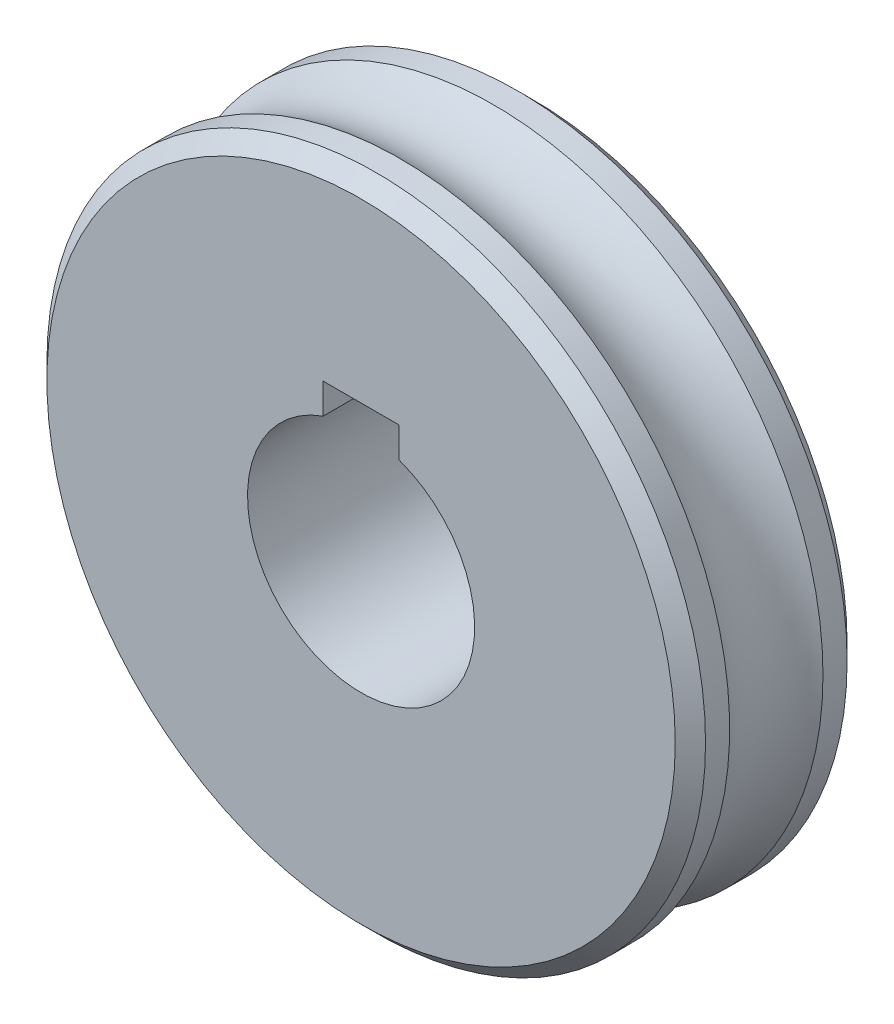
ISO-10303-21;
HEADER;
FILE_DESCRIPTION(('STEP AP214'),'2;1');
FILE_NAME('part.step','',(''),(''),'','','');
FILE_SCHEMA(('AUTOMOTIVE_DESIGN { 1 0 10303 214 1 1 1 1 }'));
ENDSEC;
DATA;
#1=APPLICATION_CONTEXT('core data for automotive mechanical design processes');
#2=APPLICATION_PROTOCOL_DEFINITION('international standard','automotive_design',2000,#1);
#3=PRODUCT_CONTEXT('',#1,'mechanical');
#4=PRODUCT('Part','Part','',(#3));
#5=PRODUCT_RELATED_PRODUCT_CATEGORY('part','',(#4));
#6=PRODUCT_DEFINITION_FORMATION('','',#4);
#7=PRODUCT_DEFINITION_CONTEXT('part definition',#1,'design');
#8=PRODUCT_DEFINITION('design','',#6,#7);
#9=PRODUCT_DEFINITION_SHAPE('','',#8);
#10=(LENGTH_UNIT() NAMED_UNIT(*) SI_UNIT(.MILLI.,.METRE.));
#11=(NAMED_UNIT(*) PLANE_ANGLE_UNIT() SI_UNIT($,.RADIAN.));
#12=(NAMED_UNIT(*) SI_UNIT($,.STERADIAN.) SOLID_ANGLE_UNIT());
#13=UNCERTAINTY_MEASURE_WITH_UNIT(LENGTH_MEASURE(1.E-05),#10,'distance_accuracy_value','');
#14=(GEOMETRIC_REPRESENTATION_CONTEXT(3) GLOBAL_UNCERTAINTY_ASSIGNED_CONTEXT((#13)) GLOBAL_UNIT_ASSIGNED_CONTEXT((#10,
#11,#12)) REPRESENTATION_CONTEXT('',''));
#15=CARTESIAN_POINT('',(0.,0.,0.));
#16=DIRECTION('',(0.,0.,1.));
#17=DIRECTION('',(1.,0.,0.));
#18=AXIS2_PLACEMENT_3D('',#15,#16,#17);
#19=CARTESIAN_POINT('',(0.,0.,11.35));
#20=DIRECTION('',(0.,0.,-1.));
#21=DIRECTION('',(-1.,0.,0.));
#22=AXIS2_PLACEMENT_3D('',#19,#20,#21);
#23=CYLINDRICAL_SURFACE('',#22,43.5);
#24=CARTESIAN_POINT('',(0.,0.,-9.35000000000001));
#25=DIRECTION('',(0.,0.,1.));
#26=DIRECTION('',(1.,0.,0.));
#27=AXIS2_PLACEMENT_3D('',#24,#25,#26);
#28=CIRCLE('',#27,43.5);
#29=CARTESIAN_POINT('',(43.5,0.,-9.35000000000001));
#30=VERTEX_POINT('',#29);
#31=EDGE_CURVE('E122',#30,#30,#28,.T.);
#32=ORIENTED_EDGE('',*,*,#31,.T.);
#33=EDGE_LOOP('',(#32));
#34=FACE_BOUND('',#33,.T.);
#35=CARTESIAN_POINT('',(0.,0.,-6.16441400296897));
#36=DIRECTION('',(0.,0.,1.));
#37=DIRECTION('',(1.,0.,0.));
#38=AXIS2_PLACEMENT_3D('',#35,#36,#37);
#39=CIRCLE('',#38,43.5);
#40=CARTESIAN_POINT('',(43.5,0.,-6.16441400296897));
#41=VERTEX_POINT('',#40);
#42=EDGE_CURVE('E44',#41,#41,#39,.T.);
#43=ORIENTED_EDGE('',*,*,#42,.F.);
#44=EDGE_LOOP('',(#43));
#45=FACE_BOUND('',#44,.T.);
#46=ADVANCED_FACE('F39',(#34,#45),#23,.T.);
#47=CARTESIAN_POINT('',(0.,0.,9.34999999999998));
#48=DIRECTION('',(0.,0.,1.));
#49=DIRECTION('',(1.,0.,0.));
#50=AXIS2_PLACEMENT_3D('',#47,#48,#49);
#51=CIRCLE('',#50,43.5);
#52=CARTESIAN_POINT('',(43.5,0.,9.34999999999998));
#53=VERTEX_POINT('',#52);
#54=EDGE_CURVE('E99',#53,#53,#51,.F.);
#55=ORIENTED_EDGE('',*,*,#54,.T.);
#56=EDGE_LOOP('',(#55));
#57=FACE_BOUND('',#56,.T.);
#58=CARTESIAN_POINT('',(0.,0.,6.16441400296897));
#59=DIRECTION('',(0.,0.,-1.));
#60=DIRECTION('',(-1.,0.,0.));
#61=AXIS2_PLACEMENT_3D('',#58,#59,#60);
#62=CIRCLE('',#61,43.5);
#63=CARTESIAN_POINT('',(-43.5,0.,6.16441400296897));
#64=VERTEX_POINT('',#63);
#65=EDGE_CURVE('E126',#64,#64,#62,.T.);
#66=ORIENTED_EDGE('',*,*,#65,.F.);
#67=EDGE_LOOP('',(#66));
#68=FACE_BOUND('',#67,.T.);
#69=ADVANCED_FACE('F136',(#57,#68),#23,.T.);
#70=CARTESIAN_POINT('',(0.,0.,11.35));
#71=DIRECTION('',(0.,0.,1.));
#72=DIRECTION('',(1.,0.,0.));
#73=AXIS2_PLACEMENT_3D('',#70,#71,#72);
#74=PLANE('',#73);
#75=CARTESIAN_POINT('',(0.,0.,11.35));
#76=DIRECTION('',(0.,0.,1.));
#77=DIRECTION('',(1.,0.,0.));
#78=AXIS2_PLACEMENT_3D('',#75,#76,#77);
#79=CIRCLE('',#78,41.5);
#80=CARTESIAN_POINT('',(41.5,0.,11.35));
#81=VERTEX_POINT('',#80);
#82=EDGE_CURVE('E11',#81,#81,#79,.T.);
#83=ORIENTED_EDGE('',*,*,#82,.T.);
#84=EDGE_LOOP('',(#83));
#85=FACE_BOUND('',#84,.T.);
#86=CARTESIAN_POINT('',(0.,0.,11.35));
#87=DIRECTION('',(0.,0.,1.));
#88=DIRECTION('',(1.,0.,0.));
#89=AXIS2_PLACEMENT_3D('',#86,#87,#88);
#90=CIRCLE('',#89,15.);
#91=CARTESIAN_POINT('',(-5.,14.142135623731,11.35));
#92=VERTEX_POINT('',#91);
#93=CARTESIAN_POINT('',(5.,14.142135623731,11.35));
#94=VERTEX_POINT('',#93);
#95=EDGE_CURVE('E91',#92,#94,#90,.T.);
#96=ORIENTED_EDGE('',*,*,#95,.F.);
#97=DIRECTION('',(0.,-1.,0.));
#98=VECTOR('',#97,1.);
#99=CARTESIAN_POINT('',(-5.,18.142135623731,11.35));
#100=LINE('',#99,#98);
#101=CARTESIAN_POINT('',(-5.,18.142135623731,11.35));
#102=VERTEX_POINT('',#101);
#103=EDGE_CURVE('E83',#102,#92,#100,.T.);
#104=ORIENTED_EDGE('',*,*,#103,.F.);
#105=DIRECTION('',(-1.,0.,0.));
#106=VECTOR('',#105,1.);
#107=CARTESIAN_POINT('',(-5.,18.142135623731,11.35));
#108=LINE('',#107,#106);
#109=CARTESIAN_POINT('',(5.,18.142135623731,11.35));
#110=VERTEX_POINT('',#109);
#111=EDGE_CURVE('E106',#110,#102,#108,.T.);
#112=ORIENTED_EDGE('',*,*,#111,.F.);
#113=DIRECTION('',(0.,1.,0.));
#114=VECTOR('',#113,1.);
#115=CARTESIAN_POINT('',(5.,18.142135623731,11.35));
#116=LINE('',#115,#114);
#117=EDGE_CURVE('E104',#94,#110,#116,.T.);
#118=ORIENTED_EDGE('',*,*,#117,.F.);
#119=EDGE_LOOP('',(#96,#104,#112,#118));
#120=FACE_BOUND('',#119,.T.);
#121=ADVANCED_FACE('F103',(#85,#120),#74,.T.);
#122=CARTESIAN_POINT('',(0.,0.,-11.35));
#123=DIRECTION('',(0.,0.,1.));
#124=DIRECTION('',(1.,0.,0.));
#125=AXIS2_PLACEMENT_3D('',#122,#123,#124);
#126=PLANE('',#125);
#127=CARTESIAN_POINT('',(0.,0.,-11.35));
#128=DIRECTION('',(0.,0.,1.));
#129=DIRECTION('',(1.,0.,0.));
#130=AXIS2_PLACEMENT_3D('',#127,#128,#129);
#131=CIRCLE('',#130,41.5);
#132=CARTESIAN_POINT('',(41.5,0.,-11.35));
#133=VERTEX_POINT('',#132);
#134=EDGE_CURVE('E49',#133,#133,#131,.F.);
#135=ORIENTED_EDGE('',*,*,#134,.T.);
#136=EDGE_LOOP('',(#135));
#137=FACE_BOUND('',#136,.T.);
#138=DIRECTION('',(0.,-1.,0.));
#139=VECTOR('',#138,1.);
#140=CARTESIAN_POINT('',(-5.,18.142135623731,-11.35));
#141=LINE('',#140,#139);
#142=CARTESIAN_POINT('',(-5.,18.142135623731,-11.35));
#143=VERTEX_POINT('',#142);
#144=CARTESIAN_POINT('',(-5.,14.142135623731,-11.35));
#145=VERTEX_POINT('',#144);
#146=EDGE_CURVE('E65',#143,#145,#141,.T.);
#147=ORIENTED_EDGE('',*,*,#146,.T.);
#148=CARTESIAN_POINT('',(0.,0.,-11.35));
#149=DIRECTION('',(0.,0.,1.));
#150=DIRECTION('',(1.,0.,0.));
#151=AXIS2_PLACEMENT_3D('',#148,#149,#150);
#152=CIRCLE('',#151,15.);
#153=CARTESIAN_POINT('',(5.,14.142135623731,-11.35));
#154=VERTEX_POINT('',#153);
#155=EDGE_CURVE('E98',#145,#154,#152,.T.);
#156=ORIENTED_EDGE('',*,*,#155,.T.);
#157=DIRECTION('',(0.,1.,0.));
#158=VECTOR('',#157,1.);
#159=CARTESIAN_POINT('',(5.,18.142135623731,-11.35));
#160=LINE('',#159,#158);
#161=CARTESIAN_POINT('',(5.,18.142135623731,-11.35));
#162=VERTEX_POINT('',#161);
#163=EDGE_CURVE('E112',#154,#162,#160,.T.);
#164=ORIENTED_EDGE('',*,*,#163,.T.);
#165=DIRECTION('',(-1.,0.,0.));
#166=VECTOR('',#165,1.);
#167=CARTESIAN_POINT('',(-5.,18.142135623731,-11.35));
#168=LINE('',#167,#166);
#169=EDGE_CURVE('E92',#162,#143,#168,.T.);
#170=ORIENTED_EDGE('',*,*,#169,.T.);
#171=EDGE_LOOP('',(#147,#156,#164,#170));
#172=FACE_BOUND('',#171,.T.);
#173=ADVANCED_FACE('F144',(#137,#172),#126,.F.);
#174=CARTESIAN_POINT('',(-5.,18.142135623731,11.35));
#175=DIRECTION('',(1.,0.,0.));
#176=DIRECTION('',(0.,1.,0.));
#177=AXIS2_PLACEMENT_3D('',#174,#175,#176);
#178=PLANE('',#177);
#179=ORIENTED_EDGE('',*,*,#146,.F.);
#180=DIRECTION('',(0.,0.,-1.));
#181=VECTOR('',#180,1.);
#182=CARTESIAN_POINT('',(-5.,18.142135623731,11.35));
#183=LINE('',#182,#181);
#184=EDGE_CURVE('E87',#102,#143,#183,.T.);
#185=ORIENTED_EDGE('',*,*,#184,.F.);
#186=ORIENTED_EDGE('',*,*,#103,.T.);
#187=DIRECTION('',(0.,0.,-1.));
#188=VECTOR('',#187,1.);
#189=CARTESIAN_POINT('',(-5.,14.142135623731,11.35));
#190=LINE('',#189,#188);
#191=EDGE_CURVE('E86',#92,#145,#190,.T.);
#192=ORIENTED_EDGE('',*,*,#191,.T.);
#193=EDGE_LOOP('',(#179,#185,#186,#192));
#194=FACE_BOUND('',#193,.T.);
#195=ADVANCED_FACE('F85',(#194),#178,.T.);
#196=CARTESIAN_POINT('',(0.,0.,11.35));
#197=DIRECTION('',(0.,0.,-1.));
#198=DIRECTION('',(-1.,0.,0.));
#199=AXIS2_PLACEMENT_3D('',#196,#197,#198);
#200=CYLINDRICAL_SURFACE('',#199,15.);
#201=ORIENTED_EDGE('',*,*,#155,.F.);
#202=ORIENTED_EDGE('',*,*,#191,.F.);
#203=ORIENTED_EDGE('',*,*,#95,.T.);
#204=DIRECTION('',(0.,0.,-1.));
#205=VECTOR('',#204,1.);
#206=CARTESIAN_POINT('',(5.,14.142135623731,11.35));
#207=LINE('',#206,#205);
#208=EDGE_CURVE('E100',#94,#154,#207,.T.);
#209=ORIENTED_EDGE('',*,*,#208,.T.);
#210=EDGE_LOOP('',(#201,#202,#203,#209));
#211=FACE_BOUND('',#210,.T.);
#212=ADVANCED_FACE('F95',(#211),#200,.F.);
#213=CARTESIAN_POINT('',(5.,18.142135623731,11.35));
#214=DIRECTION('',(-1.,0.,0.));
#215=DIRECTION('',(0.,-1.,0.));
#216=AXIS2_PLACEMENT_3D('',#213,#214,#215);
#217=PLANE('',#216);
#218=ORIENTED_EDGE('',*,*,#163,.F.);
#219=ORIENTED_EDGE('',*,*,#208,.F.);
#220=ORIENTED_EDGE('',*,*,#117,.T.);
#221=DIRECTION('',(0.,0.,-1.));
#222=VECTOR('',#221,1.);
#223=CARTESIAN_POINT('',(5.,18.142135623731,11.35));
#224=LINE('',#223,#222);
#225=EDGE_CURVE('E57',#110,#162,#224,.T.);
#226=ORIENTED_EDGE('',*,*,#225,.T.);
#227=EDGE_LOOP('',(#218,#219,#220,#226));
#228=FACE_BOUND('',#227,.T.);
#229=ADVANCED_FACE('F158',(#228),#217,.T.);
#230=CARTESIAN_POINT('',(-5.,18.142135623731,11.35));
#231=DIRECTION('',(0.,-1.,0.));
#232=DIRECTION('',(0.,0.,-1.));
#233=AXIS2_PLACEMENT_3D('',#230,#231,#232);
#234=PLANE('',#233);
#235=ORIENTED_EDGE('',*,*,#169,.F.);
#236=ORIENTED_EDGE('',*,*,#225,.F.);
#237=ORIENTED_EDGE('',*,*,#111,.T.);
#238=ORIENTED_EDGE('',*,*,#184,.T.);
#239=EDGE_LOOP('',(#235,#236,#237,#238));
#240=FACE_BOUND('',#239,.T.);
#241=ADVANCED_FACE('F151',(#240),#234,.T.);
#242=CARTESIAN_POINT('',(0.,0.,-9.35000000000001));
#243=DIRECTION('',(0.,0.,1.));
#244=DIRECTION('',(1.,0.,0.));
#245=AXIS2_PLACEMENT_3D('',#242,#243,#244);
#246=CONICAL_SURFACE('',#245,43.5,0.78539816339745);
#247=ORIENTED_EDGE('',*,*,#134,.F.);
#248=EDGE_LOOP('',(#247));
#249=FACE_BOUND('',#248,.T.);
#250=ORIENTED_EDGE('',*,*,#31,.F.);
#251=EDGE_LOOP('',(#250));
#252=FACE_BOUND('',#251,.T.);
#253=ADVANCED_FACE('F147',(#249,#252),#246,.T.);
#254=CARTESIAN_POINT('',(0.,0.,11.35));
#255=DIRECTION('',(0.,0.,-1.));
#256=DIRECTION('',(-1.,0.,0.));
#257=AXIS2_PLACEMENT_3D('',#254,#255,#256);
#258=CONICAL_SURFACE('',#257,41.5,0.785398163397441);
#259=ORIENTED_EDGE('',*,*,#54,.F.);
#260=EDGE_LOOP('',(#259));
#261=FACE_BOUND('',#260,.T.);
#262=ORIENTED_EDGE('',*,*,#82,.F.);
#263=EDGE_LOOP('',(#262));
#264=FACE_BOUND('',#263,.T.);
#265=ADVANCED_FACE('F42',(#261,#264),#258,.T.);
#266=CARTESIAN_POINT('',(0.,0.,0.));
#267=DIRECTION('',(0.,0.,-1.));
#268=DIRECTION('',(-1.,0.,0.));
#269=AXIS2_PLACEMENT_3D('',#266,#267,#268);
#270=TOROIDAL_SURFACE('',#269,52.,10.5);
#271=ORIENTED_EDGE('',*,*,#65,.T.);
#272=EDGE_LOOP('',(#271));
#273=FACE_BOUND('',#272,.T.);
#274=ORIENTED_EDGE('',*,*,#42,.T.);
#275=EDGE_LOOP('',(#274));
#276=FACE_BOUND('',#275,.T.);
#277=ADVANCED_FACE('F133',(#273,#276),#270,.F.);
#278=CLOSED_SHELL('',(#46,#69,#121,#173,#195,#212,#229,#241,#253,#265,#277));
#279=MANIFOLD_SOLID_BREP('B2',#278);
#280=ADVANCED_BREP_SHAPE_REPRESENTATION('',(#18,#279),#14);
#281=SHAPE_DEFINITION_REPRESENTATION(#9,#280);
ENDSEC;
END-ISO-10303-21;
